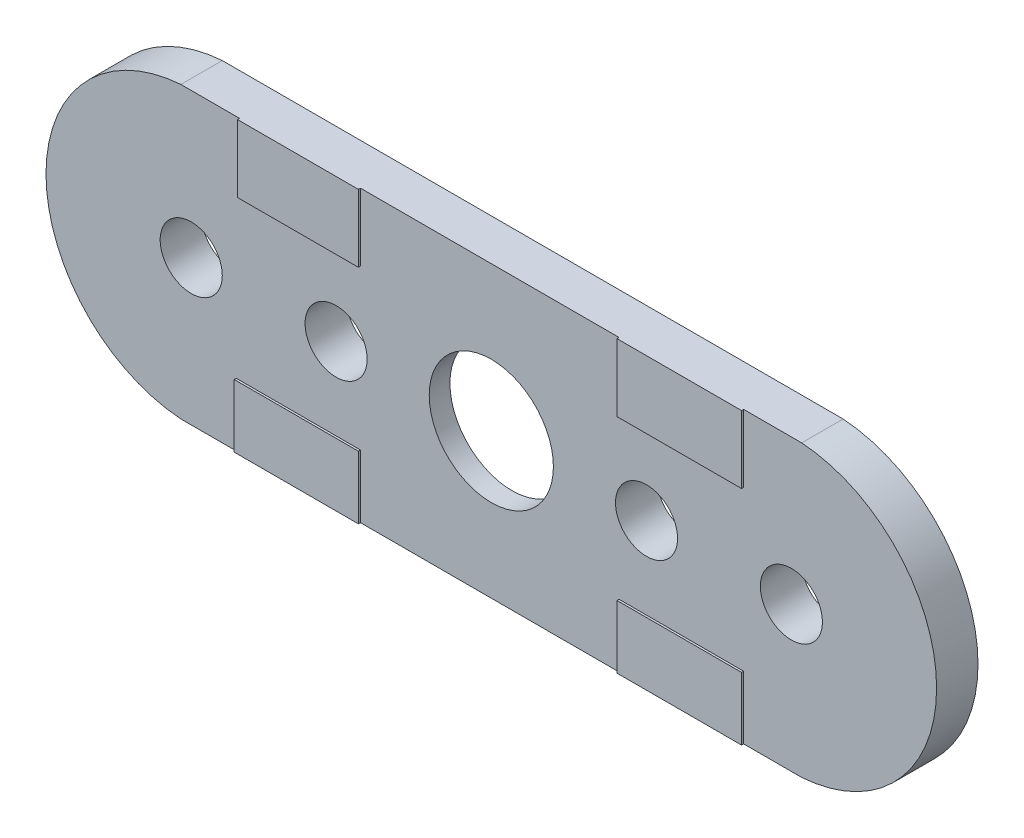
ISO-10303-21;
HEADER;
FILE_DESCRIPTION(('STEP AP214'),'2;1');
FILE_NAME('part.step','',(''),(''),'','','');
FILE_SCHEMA(('AUTOMOTIVE_DESIGN { 1 0 10303 214 1 1 1 1 }'));
ENDSEC;
DATA;
#1=APPLICATION_CONTEXT('core data for automotive mechanical design processes');
#2=APPLICATION_PROTOCOL_DEFINITION('international standard','automotive_design',2000,#1);
#3=PRODUCT_CONTEXT('',#1,'mechanical');
#4=PRODUCT('Part','Part','',(#3));
#5=PRODUCT_RELATED_PRODUCT_CATEGORY('part','',(#4));
#6=PRODUCT_DEFINITION_FORMATION('','',#4);
#7=PRODUCT_DEFINITION_CONTEXT('part definition',#1,'design');
#8=PRODUCT_DEFINITION('design','',#6,#7);
#9=PRODUCT_DEFINITION_SHAPE('','',#8);
#10=(LENGTH_UNIT() NAMED_UNIT(*) SI_UNIT(.MILLI.,.METRE.));
#11=(NAMED_UNIT(*) PLANE_ANGLE_UNIT() SI_UNIT($,.RADIAN.));
#12=(NAMED_UNIT(*) SI_UNIT($,.STERADIAN.) SOLID_ANGLE_UNIT());
#13=UNCERTAINTY_MEASURE_WITH_UNIT(LENGTH_MEASURE(1.E-05),#10,'distance_accuracy_value','');
#14=(GEOMETRIC_REPRESENTATION_CONTEXT(3) GLOBAL_UNCERTAINTY_ASSIGNED_CONTEXT((#13)) GLOBAL_UNIT_ASSIGNED_CONTEXT((#10,
#11,#12)) REPRESENTATION_CONTEXT('',''));
#15=CARTESIAN_POINT('',(0.,0.,0.));
#16=DIRECTION('',(0.,0.,1.));
#17=DIRECTION('',(1.,0.,0.));
#18=AXIS2_PLACEMENT_3D('',#15,#16,#17);
#19=CARTESIAN_POINT('',(0.,0.,2.));
#20=DIRECTION('',(0.,0.,-1.));
#21=DIRECTION('',(-1.,0.,0.));
#22=AXIS2_PLACEMENT_3D('',#19,#20,#21);
#23=CYLINDRICAL_SURFACE('',#22,3.);
#24=CARTESIAN_POINT('',(0.,0.,2.));
#25=DIRECTION('',(0.,0.,1.));
#26=DIRECTION('',(1.,0.,0.));
#27=AXIS2_PLACEMENT_3D('',#24,#25,#26);
#28=CIRCLE('',#27,3.);
#29=CARTESIAN_POINT('',(3.,0.,2.));
#30=VERTEX_POINT('',#29);
#31=EDGE_CURVE('E308',#30,#30,#28,.T.);
#32=ORIENTED_EDGE('',*,*,#31,.T.);
#33=EDGE_LOOP('',(#32));
#34=FACE_BOUND('',#33,.T.);
#35=CARTESIAN_POINT('',(0.,0.,1.));
#36=DIRECTION('',(0.,0.,-1.));
#37=DIRECTION('',(-1.,0.,0.));
#38=AXIS2_PLACEMENT_3D('',#35,#36,#37);
#39=CIRCLE('',#38,3.);
#40=CARTESIAN_POINT('',(-3.,0.,1.));
#41=VERTEX_POINT('',#40);
#42=EDGE_CURVE('E35',#41,#41,#39,.T.);
#43=ORIENTED_EDGE('',*,*,#42,.T.);
#44=EDGE_LOOP('',(#43));
#45=FACE_BOUND('',#44,.T.);
#46=ADVANCED_FACE('F31',(#34,#45),#23,.F.);
#47=CARTESIAN_POINT('',(14.5,0.,2.));
#48=DIRECTION('',(0.,0.,-1.));
#49=DIRECTION('',(-1.,0.,0.));
#50=AXIS2_PLACEMENT_3D('',#47,#48,#49);
#51=PLANE('',#50);
#52=CARTESIAN_POINT('',(-7.5,0.,2.));
#53=DIRECTION('',(0.,0.,1.));
#54=DIRECTION('',(1.,0.,0.));
#55=AXIS2_PLACEMENT_3D('',#52,#53,#54);
#56=CIRCLE('',#55,1.5);
#57=CARTESIAN_POINT('',(-6.,0.,2.));
#58=VERTEX_POINT('',#57);
#59=EDGE_CURVE('E386',#58,#58,#56,.T.);
#60=ORIENTED_EDGE('',*,*,#59,.F.);
#61=EDGE_LOOP('',(#60));
#62=FACE_BOUND('',#61,.T.);
#63=CARTESIAN_POINT('',(-14.5,0.,2.));
#64=DIRECTION('',(0.,0.,1.));
#65=DIRECTION('',(1.,0.,0.));
#66=AXIS2_PLACEMENT_3D('',#63,#64,#65);
#67=CIRCLE('',#66,1.5);
#68=CARTESIAN_POINT('',(-13.,0.,2.));
#69=VERTEX_POINT('',#68);
#70=EDGE_CURVE('E313',#69,#69,#67,.T.);
#71=ORIENTED_EDGE('',*,*,#70,.F.);
#72=EDGE_LOOP('',(#71));
#73=FACE_BOUND('',#72,.T.);
#74=ORIENTED_EDGE('',*,*,#31,.F.);
#75=EDGE_LOOP('',(#74));
#76=FACE_BOUND('',#75,.T.);
#77=CARTESIAN_POINT('',(14.5,0.,2.));
#78=DIRECTION('',(0.,0.,1.));
#79=DIRECTION('',(1.,0.,0.));
#80=AXIS2_PLACEMENT_3D('',#77,#78,#79);
#81=CIRCLE('',#80,1.5);
#82=CARTESIAN_POINT('',(16.,0.,2.));
#83=VERTEX_POINT('',#82);
#84=EDGE_CURVE('E392',#83,#83,#81,.T.);
#85=ORIENTED_EDGE('',*,*,#84,.F.);
#86=EDGE_LOOP('',(#85));
#87=FACE_BOUND('',#86,.T.);
#88=CARTESIAN_POINT('',(7.5,0.,2.));
#89=DIRECTION('',(0.,0.,1.));
#90=DIRECTION('',(1.,0.,0.));
#91=AXIS2_PLACEMENT_3D('',#88,#89,#90);
#92=CIRCLE('',#91,1.5);
#93=CARTESIAN_POINT('',(9.,0.,2.));
#94=VERTEX_POINT('',#93);
#95=EDGE_CURVE('E380',#94,#94,#92,.T.);
#96=ORIENTED_EDGE('',*,*,#95,.F.);
#97=EDGE_LOOP('',(#96));
#98=FACE_BOUND('',#97,.T.);
#99=DIRECTION('',(0.,1.,0.));
#100=VECTOR('',#99,1.);
#101=CARTESIAN_POINT('',(-6.32233913843133,6.99999999999999,2.));
#102=LINE('',#101,#100);
#103=CARTESIAN_POINT('',(-6.32233913843133,3.73670238538907,2.));
#104=VERTEX_POINT('',#103);
#105=CARTESIAN_POINT('',(-6.32233913843133,6.99999999999999,2.));
#106=VERTEX_POINT('',#105);
#107=EDGE_CURVE('E48',#104,#106,#102,.T.);
#108=ORIENTED_EDGE('',*,*,#107,.F.);
#109=DIRECTION('',(1.,0.,0.));
#110=VECTOR('',#109,1.);
#111=CARTESIAN_POINT('',(-6.32233913843133,3.73670238538907,2.));
#112=LINE('',#111,#110);
#113=CARTESIAN_POINT('',(-12.1603510875608,3.73670238538907,2.));
#114=VERTEX_POINT('',#113);
#115=EDGE_CURVE('E52',#114,#104,#112,.T.);
#116=ORIENTED_EDGE('',*,*,#115,.F.);
#117=DIRECTION('',(0.,-1.,0.));
#118=VECTOR('',#117,1.);
#119=CARTESIAN_POINT('',(-12.1603510875608,6.99999999999999,2.));
#120=LINE('',#119,#118);
#121=CARTESIAN_POINT('',(-12.1603510875608,6.99999999999999,2.));
#122=VERTEX_POINT('',#121);
#123=EDGE_CURVE('E329',#122,#114,#120,.T.);
#124=ORIENTED_EDGE('',*,*,#123,.F.);
#125=DIRECTION('',(-1.,0.,0.));
#126=VECTOR('',#125,1.);
#127=CARTESIAN_POINT('',(-15.,6.99999999999999,2.));
#128=LINE('',#127,#126);
#129=CARTESIAN_POINT('',(-15.,6.99999999999999,2.));
#130=VERTEX_POINT('',#129);
#131=EDGE_CURVE('E323',#122,#130,#128,.T.);
#132=ORIENTED_EDGE('',*,*,#131,.T.);
#133=CARTESIAN_POINT('',(-14.5,0.,2.));
#134=DIRECTION('',(0.,0.,1.));
#135=DIRECTION('',(1.,0.,0.));
#136=AXIS2_PLACEMENT_3D('',#133,#134,#135);
#137=CIRCLE('',#136,7.0178344238091);
#138=CARTESIAN_POINT('',(-15.,-7.00000000000001,2.));
#139=VERTEX_POINT('',#138);
#140=EDGE_CURVE('E283',#130,#139,#137,.T.);
#141=ORIENTED_EDGE('',*,*,#140,.T.);
#142=DIRECTION('',(1.,0.,0.));
#143=VECTOR('',#142,1.);
#144=CARTESIAN_POINT('',(-15.,-7.00000000000001,2.));
#145=LINE('',#144,#143);
#146=CARTESIAN_POINT('',(-12.3223391384313,-7.00000000000001,2.));
#147=VERTEX_POINT('',#146);
#148=EDGE_CURVE('E278',#139,#147,#145,.T.);
#149=ORIENTED_EDGE('',*,*,#148,.T.);
#150=DIRECTION('',(0.,-1.,0.));
#151=VECTOR('',#150,1.);
#152=CARTESIAN_POINT('',(-12.3223391384313,-7.00000000000001,2.));
#153=LINE('',#152,#151);
#154=CARTESIAN_POINT('',(-12.3223391384313,-3.95773003096209,2.));
#155=VERTEX_POINT('',#154);
#156=EDGE_CURVE('E203',#155,#147,#153,.T.);
#157=ORIENTED_EDGE('',*,*,#156,.F.);
#158=DIRECTION('',(-1.,0.,0.));
#159=VECTOR('',#158,1.);
#160=CARTESIAN_POINT('',(-6.32233913843133,-3.95773003096209,2.));
#161=LINE('',#160,#159);
#162=CARTESIAN_POINT('',(-6.32233913843133,-3.95773003096209,2.));
#163=VERTEX_POINT('',#162);
#164=EDGE_CURVE('E193',#163,#155,#161,.T.);
#165=ORIENTED_EDGE('',*,*,#164,.F.);
#166=DIRECTION('',(0.,1.,0.));
#167=VECTOR('',#166,1.);
#168=CARTESIAN_POINT('',(-6.32233913843133,-7.00000000000001,2.));
#169=LINE('',#168,#167);
#170=CARTESIAN_POINT('',(-6.32233913843133,-7.00000000000001,2.));
#171=VERTEX_POINT('',#170);
#172=EDGE_CURVE('E190',#171,#163,#169,.T.);
#173=ORIENTED_EDGE('',*,*,#172,.F.);
#174=CARTESIAN_POINT('',(6.17129666928984,-7.00000000000001,2.));
#175=VERTEX_POINT('',#174);
#176=EDGE_CURVE('E276',#171,#175,#145,.T.);
#177=ORIENTED_EDGE('',*,*,#176,.T.);
#178=DIRECTION('',(0.,-1.,0.));
#179=VECTOR('',#178,1.);
#180=CARTESIAN_POINT('',(6.17129666928984,-7.00000000000001,2.));
#181=LINE('',#180,#179);
#182=CARTESIAN_POINT('',(6.17129666928984,-3.95773003096209,2.));
#183=VERTEX_POINT('',#182);
#184=EDGE_CURVE('E255',#183,#175,#181,.T.);
#185=ORIENTED_EDGE('',*,*,#184,.F.);
#186=DIRECTION('',(-1.,0.,0.));
#187=VECTOR('',#186,1.);
#188=CARTESIAN_POINT('',(6.17129666928984,-3.95773003096209,2.));
#189=LINE('',#188,#187);
#190=CARTESIAN_POINT('',(12.1918525599786,-3.95773003096209,2.));
#191=VERTEX_POINT('',#190);
#192=EDGE_CURVE('E260',#191,#183,#189,.T.);
#193=ORIENTED_EDGE('',*,*,#192,.F.);
#194=DIRECTION('',(0.,1.,0.));
#195=VECTOR('',#194,1.);
#196=CARTESIAN_POINT('',(12.1918525599786,-7.00000000000001,2.));
#197=LINE('',#196,#195);
#198=CARTESIAN_POINT('',(12.1918525599786,-7.00000000000001,2.));
#199=VERTEX_POINT('',#198);
#200=EDGE_CURVE('E273',#199,#191,#197,.T.);
#201=ORIENTED_EDGE('',*,*,#200,.F.);
#202=CARTESIAN_POINT('',(15.,-7.00000000000001,2.));
#203=VERTEX_POINT('',#202);
#204=EDGE_CURVE('E279',#199,#203,#145,.T.);
#205=ORIENTED_EDGE('',*,*,#204,.T.);
#206=CARTESIAN_POINT('',(14.5,0.,2.));
#207=DIRECTION('',(0.,0.,1.));
#208=DIRECTION('',(-1.,0.,0.));
#209=AXIS2_PLACEMENT_3D('',#206,#207,#208);
#210=CIRCLE('',#209,7.0178344238091);
#211=CARTESIAN_POINT('',(15.,6.99999999999999,2.));
#212=VERTEX_POINT('',#211);
#213=EDGE_CURVE('E303',#203,#212,#210,.T.);
#214=ORIENTED_EDGE('',*,*,#213,.T.);
#215=CARTESIAN_POINT('',(12.1918525599786,6.99999999999999,2.));
#216=VERTEX_POINT('',#215);
#217=EDGE_CURVE('E324',#212,#216,#128,.T.);
#218=ORIENTED_EDGE('',*,*,#217,.T.);
#219=DIRECTION('',(0.,1.,0.));
#220=VECTOR('',#219,1.);
#221=CARTESIAN_POINT('',(12.1918525599786,6.99999999999999,2.));
#222=LINE('',#221,#220);
#223=CARTESIAN_POINT('',(12.1918525599786,3.73670238538907,2.));
#224=VERTEX_POINT('',#223);
#225=EDGE_CURVE('E225',#224,#216,#222,.T.);
#226=ORIENTED_EDGE('',*,*,#225,.F.);
#227=DIRECTION('',(1.,0.,0.));
#228=VECTOR('',#227,1.);
#229=CARTESIAN_POINT('',(12.1918525599786,3.73670238538907,2.));
#230=LINE('',#229,#228);
#231=CARTESIAN_POINT('',(6.17129666928984,3.73670238538907,2.));
#232=VERTEX_POINT('',#231);
#233=EDGE_CURVE('E230',#232,#224,#230,.T.);
#234=ORIENTED_EDGE('',*,*,#233,.F.);
#235=DIRECTION('',(0.,-1.,0.));
#236=VECTOR('',#235,1.);
#237=CARTESIAN_POINT('',(6.17129666928984,6.99999999999999,2.));
#238=LINE('',#237,#236);
#239=CARTESIAN_POINT('',(6.17129666928984,6.99999999999999,2.));
#240=VERTEX_POINT('',#239);
#241=EDGE_CURVE('E239',#240,#232,#238,.T.);
#242=ORIENTED_EDGE('',*,*,#241,.F.);
#243=EDGE_CURVE('E325',#240,#106,#128,.T.);
#244=ORIENTED_EDGE('',*,*,#243,.T.);
#245=EDGE_LOOP('',(#108,#116,#124,#132,#141,#149,#157,#165,#173,#177,#185,#193,#201,#205,#214,
#218,#226,#234,#242,#244));
#246=FACE_BOUND('',#245,.T.);
#247=ADVANCED_FACE('F326',(#62,#73,#76,#87,#98,#246),#51,.F.);
#248=CARTESIAN_POINT('',(14.5,0.,0.));
#249=DIRECTION('',(0.,0.,-1.));
#250=DIRECTION('',(-1.,0.,0.));
#251=AXIS2_PLACEMENT_3D('',#248,#249,#250);
#252=PLANE('',#251);
#253=CARTESIAN_POINT('',(0.,0.,0.));
#254=DIRECTION('',(0.,0.,-1.));
#255=DIRECTION('',(-1.,0.,0.));
#256=AXIS2_PLACEMENT_3D('',#253,#254,#255);
#257=CIRCLE('',#256,5.);
#258=CARTESIAN_POINT('',(-5.,0.,0.));
#259=VERTEX_POINT('',#258);
#260=EDGE_CURVE('E685',#259,#259,#257,.T.);
#261=ORIENTED_EDGE('',*,*,#260,.F.);
#262=EDGE_LOOP('',(#261));
#263=FACE_BOUND('',#262,.T.);
#264=CARTESIAN_POINT('',(-7.5,0.,0.));
#265=DIRECTION('',(0.,0.,1.));
#266=DIRECTION('',(1.,0.,0.));
#267=AXIS2_PLACEMENT_3D('',#264,#265,#266);
#268=CIRCLE('',#267,1.5);
#269=CARTESIAN_POINT('',(-6.,0.,0.));
#270=VERTEX_POINT('',#269);
#271=EDGE_CURVE('E383',#270,#270,#268,.T.);
#272=ORIENTED_EDGE('',*,*,#271,.T.);
#273=EDGE_LOOP('',(#272));
#274=FACE_BOUND('',#273,.T.);
#275=CARTESIAN_POINT('',(-14.5,0.,0.));
#276=DIRECTION('',(0.,0.,1.));
#277=DIRECTION('',(1.,0.,0.));
#278=AXIS2_PLACEMENT_3D('',#275,#276,#277);
#279=CIRCLE('',#278,1.5);
#280=CARTESIAN_POINT('',(-13.,0.,0.));
#281=VERTEX_POINT('',#280);
#282=EDGE_CURVE('E318',#281,#281,#279,.T.);
#283=ORIENTED_EDGE('',*,*,#282,.T.);
#284=EDGE_LOOP('',(#283));
#285=FACE_BOUND('',#284,.T.);
#286=CARTESIAN_POINT('',(14.5,0.,0.));
#287=DIRECTION('',(0.,0.,1.));
#288=DIRECTION('',(-1.,0.,0.));
#289=AXIS2_PLACEMENT_3D('',#286,#287,#288);
#290=CIRCLE('',#289,7.0178344238091);
#291=CARTESIAN_POINT('',(15.,-7.00000000000001,0.));
#292=VERTEX_POINT('',#291);
#293=CARTESIAN_POINT('',(15.,6.99999999999999,0.));
#294=VERTEX_POINT('',#293);
#295=EDGE_CURVE('E285',#292,#294,#290,.T.);
#296=ORIENTED_EDGE('',*,*,#295,.F.);
#297=DIRECTION('',(1.,0.,0.));
#298=VECTOR('',#297,1.);
#299=CARTESIAN_POINT('',(-15.,-7.00000000000001,0.));
#300=LINE('',#299,#298);
#301=CARTESIAN_POINT('',(-15.,-7.00000000000001,0.));
#302=VERTEX_POINT('',#301);
#303=EDGE_CURVE('E301',#302,#292,#300,.T.);
#304=ORIENTED_EDGE('',*,*,#303,.F.);
#305=CARTESIAN_POINT('',(-14.5,0.,0.));
#306=DIRECTION('',(0.,0.,1.));
#307=DIRECTION('',(1.,0.,0.));
#308=AXIS2_PLACEMENT_3D('',#305,#306,#307);
#309=CIRCLE('',#308,7.0178344238091);
#310=CARTESIAN_POINT('',(-15.,6.99999999999999,0.));
#311=VERTEX_POINT('',#310);
#312=EDGE_CURVE('E304',#311,#302,#309,.T.);
#313=ORIENTED_EDGE('',*,*,#312,.F.);
#314=DIRECTION('',(-1.,0.,0.));
#315=VECTOR('',#314,1.);
#316=CARTESIAN_POINT('',(-15.,6.99999999999999,0.));
#317=LINE('',#316,#315);
#318=EDGE_CURVE('E305',#294,#311,#317,.T.);
#319=ORIENTED_EDGE('',*,*,#318,.F.);
#320=EDGE_LOOP('',(#296,#304,#313,#319));
#321=FACE_BOUND('',#320,.T.);
#322=CARTESIAN_POINT('',(14.5,0.,0.));
#323=DIRECTION('',(0.,0.,1.));
#324=DIRECTION('',(1.,0.,0.));
#325=AXIS2_PLACEMENT_3D('',#322,#323,#324);
#326=CIRCLE('',#325,1.5);
#327=CARTESIAN_POINT('',(16.,0.,0.));
#328=VERTEX_POINT('',#327);
#329=EDGE_CURVE('E389',#328,#328,#326,.T.);
#330=ORIENTED_EDGE('',*,*,#329,.T.);
#331=EDGE_LOOP('',(#330));
#332=FACE_BOUND('',#331,.T.);
#333=CARTESIAN_POINT('',(7.5,0.,0.));
#334=DIRECTION('',(0.,0.,1.));
#335=DIRECTION('',(1.,0.,0.));
#336=AXIS2_PLACEMENT_3D('',#333,#334,#335);
#337=CIRCLE('',#336,1.5);
#338=CARTESIAN_POINT('',(9.,0.,0.));
#339=VERTEX_POINT('',#338);
#340=EDGE_CURVE('E357',#339,#339,#337,.T.);
#341=ORIENTED_EDGE('',*,*,#340,.T.);
#342=EDGE_LOOP('',(#341));
#343=FACE_BOUND('',#342,.T.);
#344=ADVANCED_FACE('F398',(#263,#274,#285,#321,#332,#343),#252,.T.);
#345=CARTESIAN_POINT('',(14.5,0.,2.));
#346=DIRECTION('',(0.,0.,-1.));
#347=DIRECTION('',(-1.,0.,0.));
#348=AXIS2_PLACEMENT_3D('',#345,#346,#347);
#349=CYLINDRICAL_SURFACE('',#348,7.0178344238091);
#350=ORIENTED_EDGE('',*,*,#295,.T.);
#351=DIRECTION('',(0.,0.,-1.));
#352=VECTOR('',#351,1.);
#353=CARTESIAN_POINT('',(15.,6.99999999999999,2.));
#354=LINE('',#353,#352);
#355=EDGE_CURVE('E11',#212,#294,#354,.T.);
#356=ORIENTED_EDGE('',*,*,#355,.F.);
#357=ORIENTED_EDGE('',*,*,#213,.F.);
#358=DIRECTION('',(0.,0.,-1.));
#359=VECTOR('',#358,1.);
#360=CARTESIAN_POINT('',(15.,-7.00000000000001,2.));
#361=LINE('',#360,#359);
#362=EDGE_CURVE('E292',#203,#292,#361,.T.);
#363=ORIENTED_EDGE('',*,*,#362,.T.);
#364=EDGE_LOOP('',(#350,#356,#357,#363));
#365=FACE_BOUND('',#364,.T.);
#366=ADVANCED_FACE('F33',(#365),#349,.T.);
#367=CARTESIAN_POINT('',(-15.,6.99999999999999,2.));
#368=DIRECTION('',(0.,-1.,0.));
#369=DIRECTION('',(0.,0.,-1.));
#370=AXIS2_PLACEMENT_3D('',#367,#368,#369);
#371=PLANE('',#370);
#372=ORIENTED_EDGE('',*,*,#318,.T.);
#373=DIRECTION('',(0.,0.,-1.));
#374=VECTOR('',#373,1.);
#375=CARTESIAN_POINT('',(-15.,6.99999999999999,2.));
#376=LINE('',#375,#374);
#377=EDGE_CURVE('E40',#130,#311,#376,.T.);
#378=ORIENTED_EDGE('',*,*,#377,.F.);
#379=ORIENTED_EDGE('',*,*,#131,.F.);
#380=DIRECTION('',(0.,0.,-1.));
#381=VECTOR('',#380,1.);
#382=CARTESIAN_POINT('',(-12.1603510875608,6.99999999999999,2.1));
#383=LINE('',#382,#381);
#384=CARTESIAN_POINT('',(-12.1603510875608,6.99999999999999,2.1));
#385=VERTEX_POINT('',#384);
#386=EDGE_CURVE('E175',#385,#122,#383,.T.);
#387=ORIENTED_EDGE('',*,*,#386,.F.);
#388=DIRECTION('',(-1.,0.,0.));
#389=VECTOR('',#388,1.);
#390=CARTESIAN_POINT('',(-6.32233913843133,6.99999999999999,2.1));
#391=LINE('',#390,#389);
#392=CARTESIAN_POINT('',(-6.32233913843133,6.99999999999999,2.1));
#393=VERTEX_POINT('',#392);
#394=EDGE_CURVE('E169',#393,#385,#391,.T.);
#395=ORIENTED_EDGE('',*,*,#394,.F.);
#396=DIRECTION('',(0.,0.,-1.));
#397=VECTOR('',#396,1.);
#398=CARTESIAN_POINT('',(-6.32233913843133,6.99999999999999,2.1));
#399=LINE('',#398,#397);
#400=EDGE_CURVE('E173',#393,#106,#399,.T.);
#401=ORIENTED_EDGE('',*,*,#400,.T.);
#402=ORIENTED_EDGE('',*,*,#243,.F.);
#403=DIRECTION('',(0.,0.,-1.));
#404=VECTOR('',#403,1.);
#405=CARTESIAN_POINT('',(6.17129666928984,6.99999999999999,2.1));
#406=LINE('',#405,#404);
#407=CARTESIAN_POINT('',(6.17129666928984,6.99999999999999,2.1));
#408=VERTEX_POINT('',#407);
#409=EDGE_CURVE('E249',#408,#240,#406,.T.);
#410=ORIENTED_EDGE('',*,*,#409,.F.);
#411=DIRECTION('',(-1.,0.,0.));
#412=VECTOR('',#411,1.);
#413=CARTESIAN_POINT('',(12.1918525599786,6.99999999999999,2.1));
#414=LINE('',#413,#412);
#415=CARTESIAN_POINT('',(12.1918525599786,6.99999999999999,2.1));
#416=VERTEX_POINT('',#415);
#417=EDGE_CURVE('E229',#416,#408,#414,.T.);
#418=ORIENTED_EDGE('',*,*,#417,.F.);
#419=DIRECTION('',(0.,0.,-1.));
#420=VECTOR('',#419,1.);
#421=CARTESIAN_POINT('',(12.1918525599786,6.99999999999999,2.1));
#422=LINE('',#421,#420);
#423=EDGE_CURVE('E252',#416,#216,#422,.T.);
#424=ORIENTED_EDGE('',*,*,#423,.T.);
#425=ORIENTED_EDGE('',*,*,#217,.F.);
#426=ORIENTED_EDGE('',*,*,#355,.T.);
#427=EDGE_LOOP('',(#372,#378,#379,#387,#395,#401,#402,#410,#418,#424,#425,#426));
#428=FACE_BOUND('',#427,.T.);
#429=ADVANCED_FACE('F171',(#428),#371,.F.);
#430=CARTESIAN_POINT('',(-14.5,0.,2.));
#431=DIRECTION('',(0.,0.,-1.));
#432=DIRECTION('',(-1.,0.,0.));
#433=AXIS2_PLACEMENT_3D('',#430,#431,#432);
#434=CYLINDRICAL_SURFACE('',#433,7.0178344238091);
#435=ORIENTED_EDGE('',*,*,#312,.T.);
#436=DIRECTION('',(0.,0.,-1.));
#437=VECTOR('',#436,1.);
#438=CARTESIAN_POINT('',(-15.,-7.00000000000001,2.));
#439=LINE('',#438,#437);
#440=EDGE_CURVE('E296',#139,#302,#439,.T.);
#441=ORIENTED_EDGE('',*,*,#440,.F.);
#442=ORIENTED_EDGE('',*,*,#140,.F.);
#443=ORIENTED_EDGE('',*,*,#377,.T.);
#444=EDGE_LOOP('',(#435,#441,#442,#443));
#445=FACE_BOUND('',#444,.T.);
#446=ADVANCED_FACE('F332',(#445),#434,.T.);
#447=CARTESIAN_POINT('',(-15.,-7.00000000000001,2.));
#448=DIRECTION('',(0.,1.,0.));
#449=DIRECTION('',(0.,0.,1.));
#450=AXIS2_PLACEMENT_3D('',#447,#448,#449);
#451=PLANE('',#450);
#452=ORIENTED_EDGE('',*,*,#303,.T.);
#453=ORIENTED_EDGE('',*,*,#362,.F.);
#454=ORIENTED_EDGE('',*,*,#204,.F.);
#455=DIRECTION('',(0.,0.,-1.));
#456=VECTOR('',#455,1.);
#457=CARTESIAN_POINT('',(12.1918525599786,-7.00000000000001,2.1));
#458=LINE('',#457,#456);
#459=CARTESIAN_POINT('',(12.1918525599786,-7.00000000000001,2.1));
#460=VERTEX_POINT('',#459);
#461=EDGE_CURVE('E358',#460,#199,#458,.T.);
#462=ORIENTED_EDGE('',*,*,#461,.F.);
#463=DIRECTION('',(1.,0.,0.));
#464=VECTOR('',#463,1.);
#465=CARTESIAN_POINT('',(6.17129666928984,-7.00000000000001,2.1));
#466=LINE('',#465,#464);
#467=CARTESIAN_POINT('',(6.17129666928984,-7.00000000000001,2.1));
#468=VERTEX_POINT('',#467);
#469=EDGE_CURVE('E259',#468,#460,#466,.T.);
#470=ORIENTED_EDGE('',*,*,#469,.F.);
#471=DIRECTION('',(0.,0.,-1.));
#472=VECTOR('',#471,1.);
#473=CARTESIAN_POINT('',(6.17129666928984,-7.00000000000001,2.1));
#474=LINE('',#473,#472);
#475=EDGE_CURVE('E353',#468,#175,#474,.T.);
#476=ORIENTED_EDGE('',*,*,#475,.T.);
#477=ORIENTED_EDGE('',*,*,#176,.F.);
#478=DIRECTION('',(0.,0.,-1.));
#479=VECTOR('',#478,1.);
#480=CARTESIAN_POINT('',(-6.32233913843133,-7.00000000000001,2.1));
#481=LINE('',#480,#479);
#482=CARTESIAN_POINT('',(-6.32233913843133,-7.00000000000001,2.1));
#483=VERTEX_POINT('',#482);
#484=EDGE_CURVE('E208',#483,#171,#481,.T.);
#485=ORIENTED_EDGE('',*,*,#484,.F.);
#486=DIRECTION('',(1.,0.,0.));
#487=VECTOR('',#486,1.);
#488=CARTESIAN_POINT('',(-6.32233913843133,-7.00000000000001,2.1));
#489=LINE('',#488,#487);
#490=CARTESIAN_POINT('',(-12.3223391384313,-7.00000000000001,2.1));
#491=VERTEX_POINT('',#490);
#492=EDGE_CURVE('E207',#491,#483,#489,.T.);
#493=ORIENTED_EDGE('',*,*,#492,.F.);
#494=DIRECTION('',(0.,0.,-1.));
#495=VECTOR('',#494,1.);
#496=CARTESIAN_POINT('',(-12.3223391384313,-7.00000000000001,2.1));
#497=LINE('',#496,#495);
#498=EDGE_CURVE('E216',#491,#147,#497,.T.);
#499=ORIENTED_EDGE('',*,*,#498,.T.);
#500=ORIENTED_EDGE('',*,*,#148,.F.);
#501=ORIENTED_EDGE('',*,*,#440,.T.);
#502=EDGE_LOOP('',(#452,#453,#454,#462,#470,#476,#477,#485,#493,#499,#500,#501));
#503=FACE_BOUND('',#502,.T.);
#504=ADVANCED_FACE('F336',(#503),#451,.F.);
#505=CARTESIAN_POINT('',(-14.5,0.,2.));
#506=DIRECTION('',(0.,0.,-1.));
#507=DIRECTION('',(-1.,0.,0.));
#508=AXIS2_PLACEMENT_3D('',#505,#506,#507);
#509=CYLINDRICAL_SURFACE('',#508,1.5);
#510=ORIENTED_EDGE('',*,*,#70,.T.);
#511=EDGE_LOOP('',(#510));
#512=FACE_BOUND('',#511,.T.);
#513=ORIENTED_EDGE('',*,*,#282,.F.);
#514=EDGE_LOOP('',(#513));
#515=FACE_BOUND('',#514,.T.);
#516=ADVANCED_FACE('F404',(#512,#515),#509,.F.);
#517=CARTESIAN_POINT('',(14.5,0.,2.));
#518=DIRECTION('',(0.,0.,-1.));
#519=DIRECTION('',(-1.,0.,0.));
#520=AXIS2_PLACEMENT_3D('',#517,#518,#519);
#521=CYLINDRICAL_SURFACE('',#520,1.5);
#522=ORIENTED_EDGE('',*,*,#84,.T.);
#523=EDGE_LOOP('',(#522));
#524=FACE_BOUND('',#523,.T.);
#525=ORIENTED_EDGE('',*,*,#329,.F.);
#526=EDGE_LOOP('',(#525));
#527=FACE_BOUND('',#526,.T.);
#528=ADVANCED_FACE('F401',(#524,#527),#521,.F.);
#529=CARTESIAN_POINT('',(-7.5,0.,2.));
#530=DIRECTION('',(0.,0.,-1.));
#531=DIRECTION('',(-1.,0.,0.));
#532=AXIS2_PLACEMENT_3D('',#529,#530,#531);
#533=CYLINDRICAL_SURFACE('',#532,1.5);
#534=ORIENTED_EDGE('',*,*,#59,.T.);
#535=EDGE_LOOP('',(#534));
#536=FACE_BOUND('',#535,.T.);
#537=ORIENTED_EDGE('',*,*,#271,.F.);
#538=EDGE_LOOP('',(#537));
#539=FACE_BOUND('',#538,.T.);
#540=ADVANCED_FACE('F403',(#536,#539),#533,.F.);
#541=CARTESIAN_POINT('',(7.5,0.,2.));
#542=DIRECTION('',(0.,0.,-1.));
#543=DIRECTION('',(-1.,0.,0.));
#544=AXIS2_PLACEMENT_3D('',#541,#542,#543);
#545=CYLINDRICAL_SURFACE('',#544,1.5);
#546=ORIENTED_EDGE('',*,*,#95,.T.);
#547=EDGE_LOOP('',(#546));
#548=FACE_BOUND('',#547,.T.);
#549=ORIENTED_EDGE('',*,*,#340,.F.);
#550=EDGE_LOOP('',(#549));
#551=FACE_BOUND('',#550,.T.);
#552=ADVANCED_FACE('F411',(#548,#551),#545,.F.);
#553=CARTESIAN_POINT('',(6.17129666928984,-7.00000000000001,2.1));
#554=DIRECTION('',(1.,0.,0.));
#555=DIRECTION('',(0.,0.,-1.));
#556=AXIS2_PLACEMENT_3D('',#553,#554,#555);
#557=PLANE('',#556);
#558=ORIENTED_EDGE('',*,*,#184,.T.);
#559=ORIENTED_EDGE('',*,*,#475,.F.);
#560=DIRECTION('',(0.,-1.,0.));
#561=VECTOR('',#560,1.);
#562=CARTESIAN_POINT('',(6.17129666928984,-7.00000000000001,2.1));
#563=LINE('',#562,#561);
#564=CARTESIAN_POINT('',(6.17129666928984,-3.95773003096209,2.1));
#565=VERTEX_POINT('',#564);
#566=EDGE_CURVE('E256',#565,#468,#563,.T.);
#567=ORIENTED_EDGE('',*,*,#566,.F.);
#568=DIRECTION('',(0.,0.,-1.));
#569=VECTOR('',#568,1.);
#570=CARTESIAN_POINT('',(6.17129666928984,-3.95773003096209,2.1));
#571=LINE('',#570,#569);
#572=EDGE_CURVE('E266',#565,#183,#571,.T.);
#573=ORIENTED_EDGE('',*,*,#572,.T.);
#574=EDGE_LOOP('',(#558,#559,#567,#573));
#575=FACE_BOUND('',#574,.T.);
#576=ADVANCED_FACE('F360',(#575),#557,.F.);
#577=CARTESIAN_POINT('',(12.1918525599786,-7.00000000000001,2.1));
#578=DIRECTION('',(-1.,0.,0.));
#579=DIRECTION('',(0.,0.,1.));
#580=AXIS2_PLACEMENT_3D('',#577,#578,#579);
#581=PLANE('',#580);
#582=ORIENTED_EDGE('',*,*,#200,.T.);
#583=DIRECTION('',(0.,0.,-1.));
#584=VECTOR('',#583,1.);
#585=CARTESIAN_POINT('',(12.1918525599786,-3.95773003096209,2.1));
#586=LINE('',#585,#584);
#587=CARTESIAN_POINT('',(12.1918525599786,-3.95773003096209,2.1));
#588=VERTEX_POINT('',#587);
#589=EDGE_CURVE('E369',#588,#191,#586,.T.);
#590=ORIENTED_EDGE('',*,*,#589,.F.);
#591=DIRECTION('',(0.,1.,0.));
#592=VECTOR('',#591,1.);
#593=CARTESIAN_POINT('',(12.1918525599786,-7.00000000000001,2.1));
#594=LINE('',#593,#592);
#595=EDGE_CURVE('E262',#460,#588,#594,.T.);
#596=ORIENTED_EDGE('',*,*,#595,.F.);
#597=ORIENTED_EDGE('',*,*,#461,.T.);
#598=EDGE_LOOP('',(#582,#590,#596,#597));
#599=FACE_BOUND('',#598,.T.);
#600=ADVANCED_FACE('F473',(#599),#581,.F.);
#601=CARTESIAN_POINT('',(6.17129666928984,-3.95773003096209,2.1));
#602=DIRECTION('',(0.,-1.,0.));
#603=DIRECTION('',(0.,0.,-1.));
#604=AXIS2_PLACEMENT_3D('',#601,#602,#603);
#605=PLANE('',#604);
#606=ORIENTED_EDGE('',*,*,#192,.T.);
#607=ORIENTED_EDGE('',*,*,#572,.F.);
#608=DIRECTION('',(-1.,0.,0.));
#609=VECTOR('',#608,1.);
#610=CARTESIAN_POINT('',(6.17129666928984,-3.95773003096209,2.1));
#611=LINE('',#610,#609);
#612=EDGE_CURVE('E264',#588,#565,#611,.T.);
#613=ORIENTED_EDGE('',*,*,#612,.F.);
#614=ORIENTED_EDGE('',*,*,#589,.T.);
#615=EDGE_LOOP('',(#606,#607,#613,#614));
#616=FACE_BOUND('',#615,.T.);
#617=ADVANCED_FACE('F366',(#616),#605,.F.);
#618=CARTESIAN_POINT('',(6.17129666928984,-3.95773003096209,2.1));
#619=DIRECTION('',(0.,0.,-1.));
#620=DIRECTION('',(-1.,0.,0.));
#621=AXIS2_PLACEMENT_3D('',#618,#619,#620);
#622=PLANE('',#621);
#623=ORIENTED_EDGE('',*,*,#566,.T.);
#624=ORIENTED_EDGE('',*,*,#469,.T.);
#625=ORIENTED_EDGE('',*,*,#595,.T.);
#626=ORIENTED_EDGE('',*,*,#612,.T.);
#627=EDGE_LOOP('',(#623,#624,#625,#626));
#628=FACE_BOUND('',#627,.T.);
#629=ADVANCED_FACE('F490',(#628),#622,.F.);
#630=CARTESIAN_POINT('',(12.1918525599786,6.99999999999999,2.1));
#631=DIRECTION('',(-1.,0.,0.));
#632=DIRECTION('',(0.,0.,1.));
#633=AXIS2_PLACEMENT_3D('',#630,#631,#632);
#634=PLANE('',#633);
#635=ORIENTED_EDGE('',*,*,#225,.T.);
#636=ORIENTED_EDGE('',*,*,#423,.F.);
#637=DIRECTION('',(0.,1.,0.));
#638=VECTOR('',#637,1.);
#639=CARTESIAN_POINT('',(12.1918525599786,6.99999999999999,2.1));
#640=LINE('',#639,#638);
#641=CARTESIAN_POINT('',(12.1918525599786,3.73670238538907,2.1));
#642=VERTEX_POINT('',#641);
#643=EDGE_CURVE('E226',#642,#416,#640,.T.);
#644=ORIENTED_EDGE('',*,*,#643,.F.);
#645=DIRECTION('',(0.,0.,-1.));
#646=VECTOR('',#645,1.);
#647=CARTESIAN_POINT('',(12.1918525599786,3.73670238538907,2.1));
#648=LINE('',#647,#646);
#649=EDGE_CURVE('E236',#642,#224,#648,.T.);
#650=ORIENTED_EDGE('',*,*,#649,.T.);
#651=EDGE_LOOP('',(#635,#636,#644,#650));
#652=FACE_BOUND('',#651,.T.);
#653=ADVANCED_FACE('F499',(#652),#634,.F.);
#654=CARTESIAN_POINT('',(6.17129666928984,6.99999999999999,2.1));
#655=DIRECTION('',(1.,0.,0.));
#656=DIRECTION('',(0.,0.,-1.));
#657=AXIS2_PLACEMENT_3D('',#654,#655,#656);
#658=PLANE('',#657);
#659=ORIENTED_EDGE('',*,*,#241,.T.);
#660=DIRECTION('',(0.,0.,-1.));
#661=VECTOR('',#660,1.);
#662=CARTESIAN_POINT('',(6.17129666928984,3.73670238538907,2.1));
#663=LINE('',#662,#661);
#664=CARTESIAN_POINT('',(6.17129666928984,3.73670238538907,2.1));
#665=VERTEX_POINT('',#664);
#666=EDGE_CURVE('E246',#665,#232,#663,.T.);
#667=ORIENTED_EDGE('',*,*,#666,.F.);
#668=DIRECTION('',(0.,-1.,0.));
#669=VECTOR('',#668,1.);
#670=CARTESIAN_POINT('',(6.17129666928984,6.99999999999999,2.1));
#671=LINE('',#670,#669);
#672=EDGE_CURVE('E232',#408,#665,#671,.T.);
#673=ORIENTED_EDGE('',*,*,#672,.F.);
#674=ORIENTED_EDGE('',*,*,#409,.T.);
#675=EDGE_LOOP('',(#659,#667,#673,#674));
#676=FACE_BOUND('',#675,.T.);
#677=ADVANCED_FACE('F509',(#676),#658,.F.);
#678=CARTESIAN_POINT('',(12.1918525599786,3.73670238538907,2.1));
#679=DIRECTION('',(0.,1.,0.));
#680=DIRECTION('',(0.,0.,1.));
#681=AXIS2_PLACEMENT_3D('',#678,#679,#680);
#682=PLANE('',#681);
#683=ORIENTED_EDGE('',*,*,#233,.T.);
#684=ORIENTED_EDGE('',*,*,#649,.F.);
#685=DIRECTION('',(1.,0.,0.));
#686=VECTOR('',#685,1.);
#687=CARTESIAN_POINT('',(12.1918525599786,3.73670238538907,2.1));
#688=LINE('',#687,#686);
#689=EDGE_CURVE('E234',#665,#642,#688,.T.);
#690=ORIENTED_EDGE('',*,*,#689,.F.);
#691=ORIENTED_EDGE('',*,*,#666,.T.);
#692=EDGE_LOOP('',(#683,#684,#690,#691));
#693=FACE_BOUND('',#692,.T.);
#694=ADVANCED_FACE('F519',(#693),#682,.F.);
#695=CARTESIAN_POINT('',(12.1918525599786,3.73670238538907,2.1));
#696=DIRECTION('',(0.,0.,-1.));
#697=DIRECTION('',(-1.,0.,0.));
#698=AXIS2_PLACEMENT_3D('',#695,#696,#697);
#699=PLANE('',#698);
#700=ORIENTED_EDGE('',*,*,#643,.T.);
#701=ORIENTED_EDGE('',*,*,#417,.T.);
#702=ORIENTED_EDGE('',*,*,#672,.T.);
#703=ORIENTED_EDGE('',*,*,#689,.T.);
#704=EDGE_LOOP('',(#700,#701,#702,#703));
#705=FACE_BOUND('',#704,.T.);
#706=ADVANCED_FACE('F529',(#705),#699,.F.);
#707=CARTESIAN_POINT('',(-6.32233913843133,-7.00000000000001,2.1));
#708=DIRECTION('',(-1.,0.,0.));
#709=DIRECTION('',(0.,0.,1.));
#710=AXIS2_PLACEMENT_3D('',#707,#708,#709);
#711=PLANE('',#710);
#712=ORIENTED_EDGE('',*,*,#172,.T.);
#713=DIRECTION('',(0.,0.,-1.));
#714=VECTOR('',#713,1.);
#715=CARTESIAN_POINT('',(-6.32233913843133,-3.95773003096209,2.1));
#716=LINE('',#715,#714);
#717=CARTESIAN_POINT('',(-6.32233913843133,-3.95773003096209,2.1));
#718=VERTEX_POINT('',#717);
#719=EDGE_CURVE('E222',#718,#163,#716,.T.);
#720=ORIENTED_EDGE('',*,*,#719,.F.);
#721=DIRECTION('',(0.,1.,0.));
#722=VECTOR('',#721,1.);
#723=CARTESIAN_POINT('',(-6.32233913843133,-7.00000000000001,2.1));
#724=LINE('',#723,#722);
#725=EDGE_CURVE('E199',#483,#718,#724,.T.);
#726=ORIENTED_EDGE('',*,*,#725,.F.);
#727=ORIENTED_EDGE('',*,*,#484,.T.);
#728=EDGE_LOOP('',(#712,#720,#726,#727));
#729=FACE_BOUND('',#728,.T.);
#730=ADVANCED_FACE('F351',(#729),#711,.F.);
#731=CARTESIAN_POINT('',(-6.32233913843133,-3.95773003096209,2.1));
#732=DIRECTION('',(0.,-1.,0.));
#733=DIRECTION('',(1.,0.,0.));
#734=AXIS2_PLACEMENT_3D('',#731,#732,#733);
#735=PLANE('',#734);
#736=ORIENTED_EDGE('',*,*,#164,.T.);
#737=DIRECTION('',(0.,0.,-1.));
#738=VECTOR('',#737,1.);
#739=CARTESIAN_POINT('',(-12.3223391384313,-3.95773003096209,2.1));
#740=LINE('',#739,#738);
#741=CARTESIAN_POINT('',(-12.3223391384313,-3.95773003096209,2.1));
#742=VERTEX_POINT('',#741);
#743=EDGE_CURVE('E219',#742,#155,#740,.T.);
#744=ORIENTED_EDGE('',*,*,#743,.F.);
#745=DIRECTION('',(-1.,0.,0.));
#746=VECTOR('',#745,1.);
#747=CARTESIAN_POINT('',(-6.32233913843133,-3.95773003096209,2.1));
#748=LINE('',#747,#746);
#749=EDGE_CURVE('E202',#718,#742,#748,.T.);
#750=ORIENTED_EDGE('',*,*,#749,.F.);
#751=ORIENTED_EDGE('',*,*,#719,.T.);
#752=EDGE_LOOP('',(#736,#744,#750,#751));
#753=FACE_BOUND('',#752,.T.);
#754=ADVANCED_FACE('F344',(#753),#735,.F.);
#755=CARTESIAN_POINT('',(-12.3223391384313,-7.00000000000001,2.1));
#756=DIRECTION('',(1.,0.,0.));
#757=DIRECTION('',(0.,0.,-1.));
#758=AXIS2_PLACEMENT_3D('',#755,#756,#757);
#759=PLANE('',#758);
#760=ORIENTED_EDGE('',*,*,#156,.T.);
#761=ORIENTED_EDGE('',*,*,#498,.F.);
#762=DIRECTION('',(0.,-1.,0.));
#763=VECTOR('',#762,1.);
#764=CARTESIAN_POINT('',(-12.3223391384313,-7.00000000000001,2.1));
#765=LINE('',#764,#763);
#766=EDGE_CURVE('E205',#742,#491,#765,.T.);
#767=ORIENTED_EDGE('',*,*,#766,.F.);
#768=ORIENTED_EDGE('',*,*,#743,.T.);
#769=EDGE_LOOP('',(#760,#761,#767,#768));
#770=FACE_BOUND('',#769,.T.);
#771=ADVANCED_FACE('F340',(#770),#759,.F.);
#772=CARTESIAN_POINT('',(-6.32233913843133,-3.95773003096209,2.1));
#773=DIRECTION('',(0.,0.,1.));
#774=DIRECTION('',(1.,0.,0.));
#775=AXIS2_PLACEMENT_3D('',#772,#773,#774);
#776=PLANE('',#775);
#777=ORIENTED_EDGE('',*,*,#725,.T.);
#778=ORIENTED_EDGE('',*,*,#749,.T.);
#779=ORIENTED_EDGE('',*,*,#766,.T.);
#780=ORIENTED_EDGE('',*,*,#492,.T.);
#781=EDGE_LOOP('',(#777,#778,#779,#780));
#782=FACE_BOUND('',#781,.T.);
#783=ADVANCED_FACE('F564',(#782),#776,.T.);
#784=CARTESIAN_POINT('',(-6.32233913843133,6.99999999999999,2.1));
#785=DIRECTION('',(-1.,0.,0.));
#786=DIRECTION('',(0.,0.,1.));
#787=AXIS2_PLACEMENT_3D('',#784,#785,#786);
#788=PLANE('',#787);
#789=ORIENTED_EDGE('',*,*,#107,.T.);
#790=ORIENTED_EDGE('',*,*,#400,.F.);
#791=DIRECTION('',(0.,1.,0.));
#792=VECTOR('',#791,1.);
#793=CARTESIAN_POINT('',(-6.32233913843133,6.99999999999999,2.1));
#794=LINE('',#793,#792);
#795=CARTESIAN_POINT('',(-6.32233913843133,3.73670238538907,2.1));
#796=VERTEX_POINT('',#795);
#797=EDGE_CURVE('E179',#796,#393,#794,.T.);
#798=ORIENTED_EDGE('',*,*,#797,.F.);
#799=DIRECTION('',(0.,0.,-1.));
#800=VECTOR('',#799,1.);
#801=CARTESIAN_POINT('',(-6.32233913843133,3.73670238538907,2.1));
#802=LINE('',#801,#800);
#803=EDGE_CURVE('E692',#796,#104,#802,.T.);
#804=ORIENTED_EDGE('',*,*,#803,.T.);
#805=EDGE_LOOP('',(#789,#790,#798,#804));
#806=FACE_BOUND('',#805,.T.);
#807=ADVANCED_FACE('F189',(#806),#788,.F.);
#808=CARTESIAN_POINT('',(-12.1603510875608,6.99999999999999,2.1));
#809=DIRECTION('',(1.,0.,0.));
#810=DIRECTION('',(0.,0.,-1.));
#811=AXIS2_PLACEMENT_3D('',#808,#809,#810);
#812=PLANE('',#811);
#813=ORIENTED_EDGE('',*,*,#123,.T.);
#814=DIRECTION('',(0.,0.,-1.));
#815=VECTOR('',#814,1.);
#816=CARTESIAN_POINT('',(-12.1603510875608,3.73670238538907,2.1));
#817=LINE('',#816,#815);
#818=CARTESIAN_POINT('',(-12.1603510875608,3.73670238538907,2.1));
#819=VERTEX_POINT('',#818);
#820=EDGE_CURVE('E195',#819,#114,#817,.T.);
#821=ORIENTED_EDGE('',*,*,#820,.F.);
#822=DIRECTION('',(0.,-1.,0.));
#823=VECTOR('',#822,1.);
#824=CARTESIAN_POINT('',(-12.1603510875608,6.99999999999999,2.1));
#825=LINE('',#824,#823);
#826=EDGE_CURVE('E178',#385,#819,#825,.T.);
#827=ORIENTED_EDGE('',*,*,#826,.F.);
#828=ORIENTED_EDGE('',*,*,#386,.T.);
#829=EDGE_LOOP('',(#813,#821,#827,#828));
#830=FACE_BOUND('',#829,.T.);
#831=ADVANCED_FACE('F582',(#830),#812,.F.);
#832=CARTESIAN_POINT('',(-6.32233913843133,3.73670238538907,2.1));
#833=DIRECTION('',(0.,1.,0.));
#834=DIRECTION('',(0.,0.,1.));
#835=AXIS2_PLACEMENT_3D('',#832,#833,#834);
#836=PLANE('',#835);
#837=ORIENTED_EDGE('',*,*,#115,.T.);
#838=ORIENTED_EDGE('',*,*,#803,.F.);
#839=DIRECTION('',(1.,0.,0.));
#840=VECTOR('',#839,1.);
#841=CARTESIAN_POINT('',(-6.32233913843133,3.73670238538907,2.1));
#842=LINE('',#841,#840);
#843=EDGE_CURVE('E184',#819,#796,#842,.T.);
#844=ORIENTED_EDGE('',*,*,#843,.F.);
#845=ORIENTED_EDGE('',*,*,#820,.T.);
#846=EDGE_LOOP('',(#837,#838,#844,#845));
#847=FACE_BOUND('',#846,.T.);
#848=ADVANCED_FACE('F591',(#847),#836,.F.);
#849=CARTESIAN_POINT('',(-6.32233913843133,3.73670238538907,2.1));
#850=DIRECTION('',(0.,0.,-1.));
#851=DIRECTION('',(-1.,0.,0.));
#852=AXIS2_PLACEMENT_3D('',#849,#850,#851);
#853=PLANE('',#852);
#854=ORIENTED_EDGE('',*,*,#797,.T.);
#855=ORIENTED_EDGE('',*,*,#394,.T.);
#856=ORIENTED_EDGE('',*,*,#826,.T.);
#857=ORIENTED_EDGE('',*,*,#843,.T.);
#858=EDGE_LOOP('',(#854,#855,#856,#857));
#859=FACE_BOUND('',#858,.T.);
#860=ADVANCED_FACE('F182',(#859),#853,.F.);
#861=CARTESIAN_POINT('',(0.,0.,1.));
#862=DIRECTION('',(0.,0.,-1.));
#863=DIRECTION('',(-1.,0.,0.));
#864=AXIS2_PLACEMENT_3D('',#861,#862,#863);
#865=CYLINDRICAL_SURFACE('',#864,5.);
#866=CARTESIAN_POINT('',(0.,0.,1.));
#867=DIRECTION('',(0.,0.,-1.));
#868=DIRECTION('',(-1.,0.,0.));
#869=AXIS2_PLACEMENT_3D('',#866,#867,#868);
#870=CIRCLE('',#869,5.);
#871=CARTESIAN_POINT('',(-5.,0.,1.));
#872=VERTEX_POINT('',#871);
#873=EDGE_CURVE('E684',#872,#872,#870,.T.);
#874=ORIENTED_EDGE('',*,*,#873,.F.);
#875=EDGE_LOOP('',(#874));
#876=FACE_BOUND('',#875,.T.);
#877=ORIENTED_EDGE('',*,*,#260,.T.);
#878=EDGE_LOOP('',(#877));
#879=FACE_BOUND('',#878,.T.);
#880=ADVANCED_FACE('F609',(#876,#879),#865,.F.);
#881=CARTESIAN_POINT('',(0.,0.,1.));
#882=DIRECTION('',(0.,0.,-1.));
#883=DIRECTION('',(-1.,0.,0.));
#884=AXIS2_PLACEMENT_3D('',#881,#882,#883);
#885=PLANE('',#884);
#886=ORIENTED_EDGE('',*,*,#42,.F.);
#887=EDGE_LOOP('',(#886));
#888=FACE_BOUND('',#887,.T.);
#889=ORIENTED_EDGE('',*,*,#873,.T.);
#890=EDGE_LOOP('',(#889));
#891=FACE_BOUND('',#890,.T.);
#892=ADVANCED_FACE('F623',(#888,#891),#885,.T.);
#893=CLOSED_SHELL('',(#46,#247,#344,#366,#429,#446,#504,#516,#528,#540,#552,#576,#600,#617,#629,
#653,#677,#694,#706,#730,#754,#771,#783,#807,#831,#848,#860,#880,#892));
#894=MANIFOLD_SOLID_BREP('B2',#893);
#895=ADVANCED_BREP_SHAPE_REPRESENTATION('',(#18,#894),#14);
#896=SHAPE_DEFINITION_REPRESENTATION(#9,#895);
ENDSEC;
END-ISO-10303-21;
